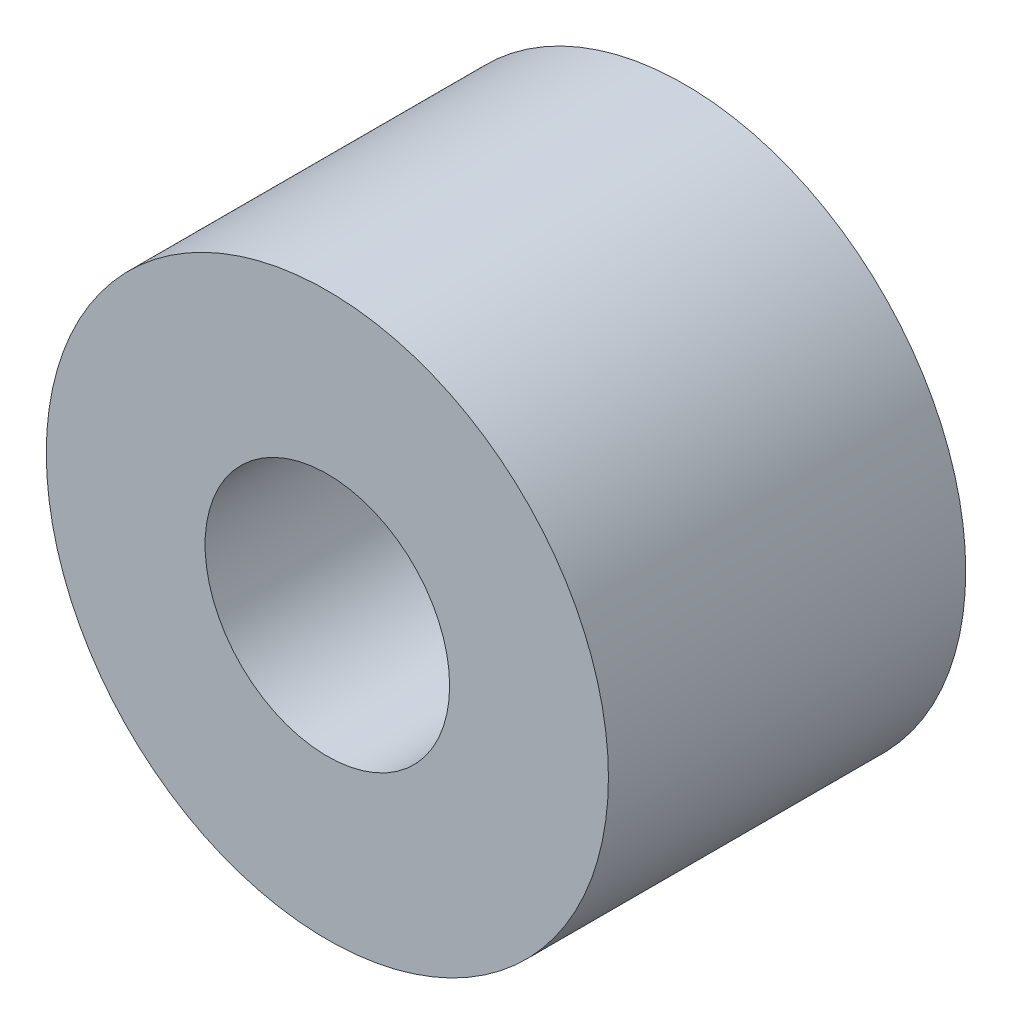
ISO-10303-21;
HEADER;
FILE_DESCRIPTION(('STEP AP214'),'2;1');
FILE_NAME('part.step','',(''),(''),'','','');
FILE_SCHEMA(('AUTOMOTIVE_DESIGN { 1 0 10303 214 1 1 1 1 }'));
ENDSEC;
DATA;
#1=APPLICATION_CONTEXT('core data for automotive mechanical design processes');
#2=APPLICATION_PROTOCOL_DEFINITION('international standard','automotive_design',2000,#1);
#3=PRODUCT_CONTEXT('',#1,'mechanical');
#4=PRODUCT('Part','Part','',(#3));
#5=PRODUCT_RELATED_PRODUCT_CATEGORY('part','',(#4));
#6=PRODUCT_DEFINITION_FORMATION('','',#4);
#7=PRODUCT_DEFINITION_CONTEXT('part definition',#1,'design');
#8=PRODUCT_DEFINITION('design','',#6,#7);
#9=PRODUCT_DEFINITION_SHAPE('','',#8);
#10=(LENGTH_UNIT() NAMED_UNIT(*) SI_UNIT(.MILLI.,.METRE.));
#11=(NAMED_UNIT(*) PLANE_ANGLE_UNIT() SI_UNIT($,.RADIAN.));
#12=(NAMED_UNIT(*) SI_UNIT($,.STERADIAN.) SOLID_ANGLE_UNIT());
#13=UNCERTAINTY_MEASURE_WITH_UNIT(LENGTH_MEASURE(1.E-05),#10,'distance_accuracy_value','');
#14=(GEOMETRIC_REPRESENTATION_CONTEXT(3) GLOBAL_UNCERTAINTY_ASSIGNED_CONTEXT((#13)) GLOBAL_UNIT_ASSIGNED_CONTEXT((#10,
#11,#12)) REPRESENTATION_CONTEXT('',''));
#15=CARTESIAN_POINT('',(0.,0.,0.));
#16=DIRECTION('',(0.,0.,1.));
#17=DIRECTION('',(1.,0.,0.));
#18=AXIS2_PLACEMENT_3D('',#15,#16,#17);
#19=CARTESIAN_POINT('',(0.,0.,14.2875));
#20=DIRECTION('',(0.,0.,1.));
#21=DIRECTION('',(1.,0.,0.));
#22=AXIS2_PLACEMENT_3D('',#19,#20,#21);
#23=PLANE('',#22);
#24=CARTESIAN_POINT('',(0.,0.,14.2875));
#25=DIRECTION('',(0.,0.,1.));
#26=DIRECTION('',(1.,0.,0.));
#27=AXIS2_PLACEMENT_3D('',#24,#25,#26);
#28=CIRCLE('',#27,11.2395);
#29=CARTESIAN_POINT('',(11.2395,0.,14.2875));
#30=VERTEX_POINT('',#29);
#31=EDGE_CURVE('E10',#30,#30,#28,.T.);
#32=ORIENTED_EDGE('',*,*,#31,.T.);
#33=EDGE_LOOP('',(#32));
#34=FACE_BOUND('',#33,.T.);
#35=CARTESIAN_POINT('',(0.,0.,14.2875));
#36=DIRECTION('',(0.,0.,1.));
#37=DIRECTION('',(1.,0.,0.));
#38=AXIS2_PLACEMENT_3D('',#35,#36,#37);
#39=CIRCLE('',#38,4.8895);
#40=CARTESIAN_POINT('',(4.8895,0.,14.2875));
#41=VERTEX_POINT('',#40);
#42=EDGE_CURVE('E45',#41,#41,#39,.T.);
#43=ORIENTED_EDGE('',*,*,#42,.F.);
#44=EDGE_LOOP('',(#43));
#45=FACE_BOUND('',#44,.T.);
#46=ADVANCED_FACE('F34',(#34,#45),#23,.T.);
#47=CARTESIAN_POINT('',(0.,0.,0.));
#48=DIRECTION('',(0.,0.,1.));
#49=DIRECTION('',(1.,0.,0.));
#50=AXIS2_PLACEMENT_3D('',#47,#48,#49);
#51=PLANE('',#50);
#52=CARTESIAN_POINT('',(0.,0.,0.));
#53=DIRECTION('',(0.,0.,1.));
#54=DIRECTION('',(1.,0.,0.));
#55=AXIS2_PLACEMENT_3D('',#52,#53,#54);
#56=CIRCLE('',#55,11.2395);
#57=CARTESIAN_POINT('',(11.2395,0.,0.));
#58=VERTEX_POINT('',#57);
#59=EDGE_CURVE('E38',#58,#58,#56,.T.);
#60=ORIENTED_EDGE('',*,*,#59,.F.);
#61=EDGE_LOOP('',(#60));
#62=FACE_BOUND('',#61,.T.);
#63=CARTESIAN_POINT('',(0.,0.,0.));
#64=DIRECTION('',(0.,0.,1.));
#65=DIRECTION('',(1.,0.,0.));
#66=AXIS2_PLACEMENT_3D('',#63,#64,#65);
#67=CIRCLE('',#66,4.8895);
#68=CARTESIAN_POINT('',(4.8895,0.,0.));
#69=VERTEX_POINT('',#68);
#70=EDGE_CURVE('E47',#69,#69,#67,.T.);
#71=ORIENTED_EDGE('',*,*,#70,.T.);
#72=EDGE_LOOP('',(#71));
#73=FACE_BOUND('',#72,.T.);
#74=ADVANCED_FACE('F57',(#62,#73),#51,.F.);
#75=CARTESIAN_POINT('',(0.,0.,14.2875));
#76=DIRECTION('',(0.,0.,-1.));
#77=DIRECTION('',(-1.,0.,0.));
#78=AXIS2_PLACEMENT_3D('',#75,#76,#77);
#79=CYLINDRICAL_SURFACE('',#78,11.2395);
#80=ORIENTED_EDGE('',*,*,#31,.F.);
#81=EDGE_LOOP('',(#80));
#82=FACE_BOUND('',#81,.T.);
#83=ORIENTED_EDGE('',*,*,#59,.T.);
#84=EDGE_LOOP('',(#83));
#85=FACE_BOUND('',#84,.T.);
#86=ADVANCED_FACE('F36',(#82,#85),#79,.T.);
#87=CARTESIAN_POINT('',(0.,0.,14.2875));
#88=DIRECTION('',(0.,0.,-1.));
#89=DIRECTION('',(-1.,0.,0.));
#90=AXIS2_PLACEMENT_3D('',#87,#88,#89);
#91=CYLINDRICAL_SURFACE('',#90,4.8895);
#92=ORIENTED_EDGE('',*,*,#42,.T.);
#93=EDGE_LOOP('',(#92));
#94=FACE_BOUND('',#93,.T.);
#95=ORIENTED_EDGE('',*,*,#70,.F.);
#96=EDGE_LOOP('',(#95));
#97=FACE_BOUND('',#96,.T.);
#98=ADVANCED_FACE('F53',(#94,#97),#91,.F.);
#99=CLOSED_SHELL('',(#46,#74,#86,#98));
#100=MANIFOLD_SOLID_BREP('B2',#99);
#101=ADVANCED_BREP_SHAPE_REPRESENTATION('',(#18,#100),#14);
#102=SHAPE_DEFINITION_REPRESENTATION(#9,#101);
ENDSEC;
END-ISO-10303-21;
